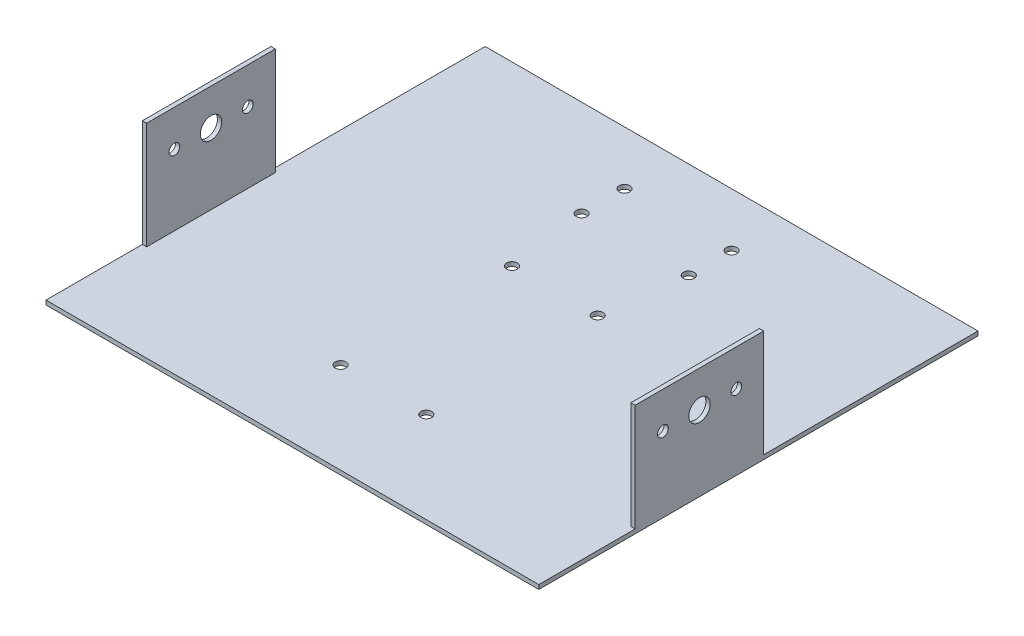
ISO-10303-21;
HEADER;
FILE_DESCRIPTION(('STEP AP214'),'2;1');
FILE_NAME('part.step','',(''),(''),'','','');
FILE_SCHEMA(('AUTOMOTIVE_DESIGN { 1 0 10303 214 1 1 1 1 }'));
ENDSEC;
DATA;
#1=APPLICATION_CONTEXT('core data for automotive mechanical design processes');
#2=APPLICATION_PROTOCOL_DEFINITION('international standard','automotive_design',2000,#1);
#3=PRODUCT_CONTEXT('',#1,'mechanical');
#4=PRODUCT('Part','Part','',(#3));
#5=PRODUCT_RELATED_PRODUCT_CATEGORY('part','',(#4));
#6=PRODUCT_DEFINITION_FORMATION('','',#4);
#7=PRODUCT_DEFINITION_CONTEXT('part definition',#1,'design');
#8=PRODUCT_DEFINITION('design','',#6,#7);
#9=PRODUCT_DEFINITION_SHAPE('','',#8);
#10=(LENGTH_UNIT() NAMED_UNIT(*) SI_UNIT(.MILLI.,.METRE.));
#11=(NAMED_UNIT(*) PLANE_ANGLE_UNIT() SI_UNIT($,.RADIAN.));
#12=(NAMED_UNIT(*) SI_UNIT($,.STERADIAN.) SOLID_ANGLE_UNIT());
#13=UNCERTAINTY_MEASURE_WITH_UNIT(LENGTH_MEASURE(1.E-05),#10,'distance_accuracy_value','');
#14=(GEOMETRIC_REPRESENTATION_CONTEXT(3) GLOBAL_UNCERTAINTY_ASSIGNED_CONTEXT((#13)) GLOBAL_UNIT_ASSIGNED_CONTEXT((#10,
#11,#12)) REPRESENTATION_CONTEXT('',''));
#15=CARTESIAN_POINT('',(0.,0.,0.));
#16=DIRECTION('',(0.,0.,1.));
#17=DIRECTION('',(1.,0.,0.));
#18=AXIS2_PLACEMENT_3D('',#15,#16,#17);
#19=CARTESIAN_POINT('',(0.,2.,0.));
#20=DIRECTION('',(0.,-1.,0.));
#21=DIRECTION('',(0.,0.,-1.));
#22=AXIS2_PLACEMENT_3D('',#19,#20,#21);
#23=PLANE('',#22);
#24=CARTESIAN_POINT('',(24.9999999999999,2.,-85.));
#25=DIRECTION('',(0.,1.,0.));
#26=DIRECTION('',(0.,0.,-1.));
#27=AXIS2_PLACEMENT_3D('',#24,#25,#26);
#28=CIRCLE('',#27,2.5);
#29=CARTESIAN_POINT('',(24.9999999999999,2.,-87.5));
#30=VERTEX_POINT('',#29);
#31=EDGE_CURVE('E258',#30,#30,#28,.T.);
#32=ORIENTED_EDGE('',*,*,#31,.F.);
#33=EDGE_LOOP('',(#32));
#34=FACE_BOUND('',#33,.T.);
#35=CARTESIAN_POINT('',(25.,2.,-105.));
#36=DIRECTION('',(0.,1.,0.));
#37=DIRECTION('',(0.,0.,-1.));
#38=AXIS2_PLACEMENT_3D('',#35,#36,#37);
#39=CIRCLE('',#38,2.5);
#40=CARTESIAN_POINT('',(25.,2.,-107.5));
#41=VERTEX_POINT('',#40);
#42=EDGE_CURVE('E254',#41,#41,#39,.T.);
#43=ORIENTED_EDGE('',*,*,#42,.F.);
#44=EDGE_LOOP('',(#43));
#45=FACE_BOUND('',#44,.T.);
#46=CARTESIAN_POINT('',(-25.,2.,-85.0000000000001));
#47=DIRECTION('',(0.,1.,0.));
#48=DIRECTION('',(0.,0.,1.));
#49=AXIS2_PLACEMENT_3D('',#46,#47,#48);
#50=CIRCLE('',#49,2.5);
#51=CARTESIAN_POINT('',(-25.,2.,-82.5000000000001));
#52=VERTEX_POINT('',#51);
#53=EDGE_CURVE('E250',#52,#52,#50,.T.);
#54=ORIENTED_EDGE('',*,*,#53,.F.);
#55=EDGE_LOOP('',(#54));
#56=FACE_BOUND('',#55,.T.);
#57=CARTESIAN_POINT('',(-25.,2.,-105.));
#58=DIRECTION('',(0.,1.,0.));
#59=DIRECTION('',(0.,0.,1.));
#60=AXIS2_PLACEMENT_3D('',#57,#58,#59);
#61=CIRCLE('',#60,2.5);
#62=CARTESIAN_POINT('',(-25.,2.,-102.5));
#63=VERTEX_POINT('',#62);
#64=EDGE_CURVE('E152',#63,#63,#61,.T.);
#65=ORIENTED_EDGE('',*,*,#64,.F.);
#66=EDGE_LOOP('',(#65));
#67=FACE_BOUND('',#66,.T.);
#68=CARTESIAN_POINT('',(20.,2.,32.4999999999999));
#69=DIRECTION('',(0.,1.,0.));
#70=DIRECTION('',(0.,0.,1.));
#71=AXIS2_PLACEMENT_3D('',#68,#69,#70);
#72=CIRCLE('',#71,2.5);
#73=CARTESIAN_POINT('',(20.,2.,35.));
#74=VERTEX_POINT('',#73);
#75=EDGE_CURVE('E155',#74,#74,#72,.T.);
#76=ORIENTED_EDGE('',*,*,#75,.F.);
#77=EDGE_LOOP('',(#76));
#78=FACE_BOUND('',#77,.T.);
#79=CARTESIAN_POINT('',(-20.,2.,32.4999999999999));
#80=DIRECTION('',(0.,1.,0.));
#81=DIRECTION('',(0.,0.,1.));
#82=AXIS2_PLACEMENT_3D('',#79,#80,#81);
#83=CIRCLE('',#82,2.5);
#84=CARTESIAN_POINT('',(-20.,2.,35.));
#85=VERTEX_POINT('',#84);
#86=EDGE_CURVE('E160',#85,#85,#83,.T.);
#87=ORIENTED_EDGE('',*,*,#86,.F.);
#88=EDGE_LOOP('',(#87));
#89=FACE_BOUND('',#88,.T.);
#90=CARTESIAN_POINT('',(20.,2.,-47.5000000000001));
#91=DIRECTION('',(0.,1.,0.));
#92=DIRECTION('',(0.,0.,1.));
#93=AXIS2_PLACEMENT_3D('',#90,#91,#92);
#94=CIRCLE('',#93,2.5);
#95=CARTESIAN_POINT('',(20.,2.,-45.0000000000001));
#96=VERTEX_POINT('',#95);
#97=EDGE_CURVE('E164',#96,#96,#94,.T.);
#98=ORIENTED_EDGE('',*,*,#97,.F.);
#99=EDGE_LOOP('',(#98));
#100=FACE_BOUND('',#99,.T.);
#101=CARTESIAN_POINT('',(-20.,2.,-47.5000000000001));
#102=DIRECTION('',(0.,1.,0.));
#103=DIRECTION('',(0.,0.,1.));
#104=AXIS2_PLACEMENT_3D('',#101,#102,#103);
#105=CIRCLE('',#104,2.5);
#106=CARTESIAN_POINT('',(-20.,2.,-45.0000000000001));
#107=VERTEX_POINT('',#106);
#108=EDGE_CURVE('E168',#107,#107,#105,.T.);
#109=ORIENTED_EDGE('',*,*,#108,.F.);
#110=EDGE_LOOP('',(#109));
#111=FACE_BOUND('',#110,.T.);
#112=DIRECTION('',(-1.,0.,0.));
#113=VECTOR('',#112,1.);
#114=CARTESIAN_POINT('',(113.,2.,-30.));
#115=LINE('',#114,#113);
#116=CARTESIAN_POINT('',(115.,2.,-30.));
#117=VERTEX_POINT('',#116);
#118=CARTESIAN_POINT('',(113.,2.,-30.));
#119=VERTEX_POINT('',#118);
#120=EDGE_CURVE('E182',#117,#119,#115,.T.);
#121=ORIENTED_EDGE('',*,*,#120,.F.);
#122=DIRECTION('',(0.,0.,-1.));
#123=VECTOR('',#122,1.);
#124=CARTESIAN_POINT('',(115.,2.,50.));
#125=LINE('',#124,#123);
#126=CARTESIAN_POINT('',(115.,2.,-130.));
#127=VERTEX_POINT('',#126);
#128=EDGE_CURVE('E313',#117,#127,#125,.T.);
#129=ORIENTED_EDGE('',*,*,#128,.T.);
#130=DIRECTION('',(-1.,0.,0.));
#131=VECTOR('',#130,1.);
#132=CARTESIAN_POINT('',(115.,2.,-130.));
#133=LINE('',#132,#131);
#134=CARTESIAN_POINT('',(-115.,2.,-130.));
#135=VERTEX_POINT('',#134);
#136=EDGE_CURVE('E143',#127,#135,#133,.T.);
#137=ORIENTED_EDGE('',*,*,#136,.T.);
#138=DIRECTION('',(0.,0.,1.));
#139=VECTOR('',#138,1.);
#140=CARTESIAN_POINT('',(-115.,2.,75.));
#141=LINE('',#140,#139);
#142=CARTESIAN_POINT('',(-115.,2.,-30.));
#143=VERTEX_POINT('',#142);
#144=EDGE_CURVE('E323',#135,#143,#141,.T.);
#145=ORIENTED_EDGE('',*,*,#144,.T.);
#146=DIRECTION('',(-1.,0.,0.));
#147=VECTOR('',#146,1.);
#148=CARTESIAN_POINT('',(-113.,2.,-30.));
#149=LINE('',#148,#147);
#150=CARTESIAN_POINT('',(-113.,2.,-30.));
#151=VERTEX_POINT('',#150);
#152=EDGE_CURVE('E211',#151,#143,#149,.T.);
#153=ORIENTED_EDGE('',*,*,#152,.F.);
#154=DIRECTION('',(0.,0.,-1.));
#155=VECTOR('',#154,1.);
#156=CARTESIAN_POINT('',(-113.,2.,30.));
#157=LINE('',#156,#155);
#158=CARTESIAN_POINT('',(-113.,2.,30.));
#159=VERTEX_POINT('',#158);
#160=EDGE_CURVE('E197',#159,#151,#157,.T.);
#161=ORIENTED_EDGE('',*,*,#160,.F.);
#162=DIRECTION('',(1.,0.,0.));
#163=VECTOR('',#162,1.);
#164=CARTESIAN_POINT('',(-113.,2.,30.));
#165=LINE('',#164,#163);
#166=CARTESIAN_POINT('',(-115.,2.,30.0000000000001));
#167=VERTEX_POINT('',#166);
#168=EDGE_CURVE('E202',#167,#159,#165,.T.);
#169=ORIENTED_EDGE('',*,*,#168,.F.);
#170=CARTESIAN_POINT('',(-115.,2.,75.));
#171=VERTEX_POINT('',#170);
#172=EDGE_CURVE('E219',#167,#171,#141,.T.);
#173=ORIENTED_EDGE('',*,*,#172,.T.);
#174=DIRECTION('',(1.,0.,0.));
#175=VECTOR('',#174,1.);
#176=CARTESIAN_POINT('',(-115.,2.,75.));
#177=LINE('',#176,#175);
#178=CARTESIAN_POINT('',(115.,2.,75.));
#179=VERTEX_POINT('',#178);
#180=EDGE_CURVE('E321',#171,#179,#177,.T.);
#181=ORIENTED_EDGE('',*,*,#180,.T.);
#182=CARTESIAN_POINT('',(115.,2.,30.));
#183=VERTEX_POINT('',#182);
#184=EDGE_CURVE('E320',#179,#183,#125,.T.);
#185=ORIENTED_EDGE('',*,*,#184,.T.);
#186=DIRECTION('',(1.,0.,0.));
#187=VECTOR('',#186,1.);
#188=CARTESIAN_POINT('',(113.,2.,30.));
#189=LINE('',#188,#187);
#190=CARTESIAN_POINT('',(113.,2.,30.));
#191=VERTEX_POINT('',#190);
#192=EDGE_CURVE('E55',#191,#183,#189,.T.);
#193=ORIENTED_EDGE('',*,*,#192,.F.);
#194=DIRECTION('',(0.,0.,1.));
#195=VECTOR('',#194,1.);
#196=CARTESIAN_POINT('',(113.,2.,30.));
#197=LINE('',#196,#195);
#198=EDGE_CURVE('E50',#119,#191,#197,.T.);
#199=ORIENTED_EDGE('',*,*,#198,.F.);
#200=EDGE_LOOP('',(#121,#129,#137,#145,#153,#161,#169,#173,#181,#185,#193,#199));
#201=FACE_BOUND('',#200,.T.);
#202=ADVANCED_FACE('F33',(#34,#45,#56,#67,#78,#89,#100,#111,#201),#23,.F.);
#203=CARTESIAN_POINT('',(-115.,2.,75.));
#204=DIRECTION('',(0.,0.,-1.));
#205=DIRECTION('',(-1.,0.,0.));
#206=AXIS2_PLACEMENT_3D('',#203,#204,#205);
#207=PLANE('',#206);
#208=DIRECTION('',(1.,0.,0.));
#209=VECTOR('',#208,1.);
#210=CARTESIAN_POINT('',(-115.,0.,75.));
#211=LINE('',#210,#209);
#212=CARTESIAN_POINT('',(-115.,0.,75.));
#213=VERTEX_POINT('',#212);
#214=CARTESIAN_POINT('',(115.,0.,75.));
#215=VERTEX_POINT('',#214);
#216=EDGE_CURVE('E135',#213,#215,#211,.T.);
#217=ORIENTED_EDGE('',*,*,#216,.T.);
#218=DIRECTION('',(0.,-1.,0.));
#219=VECTOR('',#218,1.);
#220=CARTESIAN_POINT('',(115.,2.,75.));
#221=LINE('',#220,#219);
#222=EDGE_CURVE('E42',#179,#215,#221,.T.);
#223=ORIENTED_EDGE('',*,*,#222,.F.);
#224=ORIENTED_EDGE('',*,*,#180,.F.);
#225=DIRECTION('',(0.,-1.,0.));
#226=VECTOR('',#225,1.);
#227=CARTESIAN_POINT('',(-115.,2.,75.));
#228=LINE('',#227,#226);
#229=EDGE_CURVE('E11',#171,#213,#228,.T.);
#230=ORIENTED_EDGE('',*,*,#229,.T.);
#231=EDGE_LOOP('',(#217,#223,#224,#230));
#232=FACE_BOUND('',#231,.T.);
#233=ADVANCED_FACE('F35',(#232),#207,.F.);
#234=CARTESIAN_POINT('',(115.,2.,-50.));
#235=DIRECTION('',(-1.,0.,0.));
#236=DIRECTION('',(0.,0.,1.));
#237=AXIS2_PLACEMENT_3D('',#234,#235,#236);
#238=PLANE('',#237);
#239=CARTESIAN_POINT('',(115.,35.,17.0638765129619));
#240=DIRECTION('',(-1.,0.,0.));
#241=DIRECTION('',(0.,0.,1.));
#242=AXIS2_PLACEMENT_3D('',#239,#240,#241);
#243=CIRCLE('',#242,2.5);
#244=CARTESIAN_POINT('',(115.,35.,19.5638765129619));
#245=VERTEX_POINT('',#244);
#246=EDGE_CURVE('E273',#245,#245,#243,.T.);
#247=ORIENTED_EDGE('',*,*,#246,.T.);
#248=EDGE_LOOP('',(#247));
#249=FACE_BOUND('',#248,.T.);
#250=CARTESIAN_POINT('',(115.,35.,-17.2237374562249));
#251=DIRECTION('',(-1.,0.,0.));
#252=DIRECTION('',(0.,0.,1.));
#253=AXIS2_PLACEMENT_3D('',#250,#251,#252);
#254=CIRCLE('',#253,2.5);
#255=CARTESIAN_POINT('',(115.,35.,-14.7237374562249));
#256=VERTEX_POINT('',#255);
#257=EDGE_CURVE('E270',#256,#256,#254,.T.);
#258=ORIENTED_EDGE('',*,*,#257,.T.);
#259=EDGE_LOOP('',(#258));
#260=FACE_BOUND('',#259,.T.);
#261=CARTESIAN_POINT('',(115.,35.05138551,0.));
#262=DIRECTION('',(-1.,0.,0.));
#263=DIRECTION('',(0.,0.,1.));
#264=AXIS2_PLACEMENT_3D('',#261,#262,#263);
#265=CIRCLE('',#264,5.);
#266=CARTESIAN_POINT('',(115.,35.05138551,5.00000000000002));
#267=VERTEX_POINT('',#266);
#268=EDGE_CURVE('E288',#267,#267,#265,.T.);
#269=ORIENTED_EDGE('',*,*,#268,.T.);
#270=EDGE_LOOP('',(#269));
#271=FACE_BOUND('',#270,.T.);
#272=DIRECTION('',(0.,0.,-1.));
#273=VECTOR('',#272,1.);
#274=CARTESIAN_POINT('',(115.,0.,-50.));
#275=LINE('',#274,#273);
#276=CARTESIAN_POINT('',(115.,0.,-130.));
#277=VERTEX_POINT('',#276);
#278=EDGE_CURVE('E123',#215,#277,#275,.T.);
#279=ORIENTED_EDGE('',*,*,#278,.T.);
#280=DIRECTION('',(0.,1.,0.));
#281=VECTOR('',#280,1.);
#282=CARTESIAN_POINT('',(115.,0.,-130.));
#283=LINE('',#282,#281);
#284=EDGE_CURVE('E126',#277,#127,#283,.T.);
#285=ORIENTED_EDGE('',*,*,#284,.T.);
#286=ORIENTED_EDGE('',*,*,#128,.F.);
#287=DIRECTION('',(0.,-1.,0.));
#288=VECTOR('',#287,1.);
#289=CARTESIAN_POINT('',(115.,52.,-30.));
#290=LINE('',#289,#288);
#291=CARTESIAN_POINT('',(115.,52.,-30.));
#292=VERTEX_POINT('',#291);
#293=EDGE_CURVE('E181',#292,#117,#290,.T.);
#294=ORIENTED_EDGE('',*,*,#293,.F.);
#295=DIRECTION('',(0.,0.,-1.));
#296=VECTOR('',#295,1.);
#297=CARTESIAN_POINT('',(115.,52.,-30.));
#298=LINE('',#297,#296);
#299=CARTESIAN_POINT('',(115.,52.,30.));
#300=VERTEX_POINT('',#299);
#301=EDGE_CURVE('E179',#300,#292,#298,.T.);
#302=ORIENTED_EDGE('',*,*,#301,.F.);
#303=DIRECTION('',(0.,-1.,0.));
#304=VECTOR('',#303,1.);
#305=CARTESIAN_POINT('',(115.,52.,30.));
#306=LINE('',#305,#304);
#307=EDGE_CURVE('E189',#300,#183,#306,.T.);
#308=ORIENTED_EDGE('',*,*,#307,.T.);
#309=ORIENTED_EDGE('',*,*,#184,.F.);
#310=ORIENTED_EDGE('',*,*,#222,.T.);
#311=EDGE_LOOP('',(#279,#285,#286,#294,#302,#308,#309,#310));
#312=FACE_BOUND('',#311,.T.);
#313=ADVANCED_FACE('F125',(#249,#260,#271,#312),#238,.F.);
#314=CARTESIAN_POINT('',(-115.,2.,-50.));
#315=DIRECTION('',(1.,0.,0.));
#316=DIRECTION('',(0.,0.,-1.));
#317=AXIS2_PLACEMENT_3D('',#314,#315,#316);
#318=PLANE('',#317);
#319=CARTESIAN_POINT('',(-115.,35.,17.0638765129619));
#320=DIRECTION('',(-1.,0.,0.));
#321=DIRECTION('',(0.,0.,1.));
#322=AXIS2_PLACEMENT_3D('',#319,#320,#321);
#323=CIRCLE('',#322,2.5);
#324=CARTESIAN_POINT('',(-115.,35.,19.5638765129619));
#325=VERTEX_POINT('',#324);
#326=EDGE_CURVE('E565',#325,#325,#323,.T.);
#327=ORIENTED_EDGE('',*,*,#326,.F.);
#328=EDGE_LOOP('',(#327));
#329=FACE_BOUND('',#328,.T.);
#330=CARTESIAN_POINT('',(-115.,35.,-17.2237374562249));
#331=DIRECTION('',(-1.,0.,0.));
#332=DIRECTION('',(0.,0.,1.));
#333=AXIS2_PLACEMENT_3D('',#330,#331,#332);
#334=CIRCLE('',#333,2.5);
#335=CARTESIAN_POINT('',(-115.,35.,-14.7237374562249));
#336=VERTEX_POINT('',#335);
#337=EDGE_CURVE('E266',#336,#336,#334,.T.);
#338=ORIENTED_EDGE('',*,*,#337,.F.);
#339=EDGE_LOOP('',(#338));
#340=FACE_BOUND('',#339,.T.);
#341=CARTESIAN_POINT('',(-115.,35.05138551,0.));
#342=DIRECTION('',(-1.,0.,0.));
#343=DIRECTION('',(0.,0.,1.));
#344=AXIS2_PLACEMENT_3D('',#341,#342,#343);
#345=CIRCLE('',#344,5.);
#346=CARTESIAN_POINT('',(-115.,35.05138551,5.00000000000005));
#347=VERTEX_POINT('',#346);
#348=EDGE_CURVE('E262',#347,#347,#345,.T.);
#349=ORIENTED_EDGE('',*,*,#348,.F.);
#350=EDGE_LOOP('',(#349));
#351=FACE_BOUND('',#350,.T.);
#352=DIRECTION('',(0.,0.,1.));
#353=VECTOR('',#352,1.);
#354=CARTESIAN_POINT('',(-115.,0.,-50.));
#355=LINE('',#354,#353);
#356=CARTESIAN_POINT('',(-115.,0.,-130.));
#357=VERTEX_POINT('',#356);
#358=EDGE_CURVE('E134',#357,#213,#355,.T.);
#359=ORIENTED_EDGE('',*,*,#358,.T.);
#360=ORIENTED_EDGE('',*,*,#229,.F.);
#361=ORIENTED_EDGE('',*,*,#172,.F.);
#362=DIRECTION('',(0.,-1.,0.));
#363=VECTOR('',#362,1.);
#364=CARTESIAN_POINT('',(-115.,52.,30.));
#365=LINE('',#364,#363);
#366=CARTESIAN_POINT('',(-115.,52.,30.));
#367=VERTEX_POINT('',#366);
#368=EDGE_CURVE('E226',#367,#167,#365,.T.);
#369=ORIENTED_EDGE('',*,*,#368,.F.);
#370=DIRECTION('',(0.,0.,1.));
#371=VECTOR('',#370,1.);
#372=CARTESIAN_POINT('',(-115.,52.,-30.));
#373=LINE('',#372,#371);
#374=CARTESIAN_POINT('',(-115.,52.,-30.));
#375=VERTEX_POINT('',#374);
#376=EDGE_CURVE('E204',#375,#367,#373,.T.);
#377=ORIENTED_EDGE('',*,*,#376,.F.);
#378=DIRECTION('',(0.,-1.,0.));
#379=VECTOR('',#378,1.);
#380=CARTESIAN_POINT('',(-115.,52.,-30.));
#381=LINE('',#380,#379);
#382=EDGE_CURVE('E222',#375,#143,#381,.T.);
#383=ORIENTED_EDGE('',*,*,#382,.T.);
#384=ORIENTED_EDGE('',*,*,#144,.F.);
#385=DIRECTION('',(0.,1.,0.));
#386=VECTOR('',#385,1.);
#387=CARTESIAN_POINT('',(-115.,0.,-130.));
#388=LINE('',#387,#386);
#389=EDGE_CURVE('E144',#357,#135,#388,.T.);
#390=ORIENTED_EDGE('',*,*,#389,.F.);
#391=EDGE_LOOP('',(#359,#360,#361,#369,#377,#383,#384,#390));
#392=FACE_BOUND('',#391,.T.);
#393=ADVANCED_FACE('F347',(#329,#340,#351,#392),#318,.F.);
#394=CARTESIAN_POINT('',(0.,0.,0.));
#395=DIRECTION('',(0.,-1.,0.));
#396=DIRECTION('',(0.,0.,-1.));
#397=AXIS2_PLACEMENT_3D('',#394,#395,#396);
#398=PLANE('',#397);
#399=CARTESIAN_POINT('',(24.9999999999999,0.,-85.));
#400=DIRECTION('',(0.,-1.,0.));
#401=DIRECTION('',(0.,0.,-1.));
#402=AXIS2_PLACEMENT_3D('',#399,#400,#401);
#403=CIRCLE('',#402,2.5);
#404=CARTESIAN_POINT('',(24.9999999999999,0.,-87.5));
#405=VERTEX_POINT('',#404);
#406=EDGE_CURVE('E255',#405,#405,#403,.T.);
#407=ORIENTED_EDGE('',*,*,#406,.F.);
#408=EDGE_LOOP('',(#407));
#409=FACE_BOUND('',#408,.T.);
#410=CARTESIAN_POINT('',(25.,0.,-105.));
#411=DIRECTION('',(0.,-1.,0.));
#412=DIRECTION('',(0.,0.,-1.));
#413=AXIS2_PLACEMENT_3D('',#410,#411,#412);
#414=CIRCLE('',#413,2.5);
#415=CARTESIAN_POINT('',(25.,0.,-107.5));
#416=VERTEX_POINT('',#415);
#417=EDGE_CURVE('E251',#416,#416,#414,.T.);
#418=ORIENTED_EDGE('',*,*,#417,.F.);
#419=EDGE_LOOP('',(#418));
#420=FACE_BOUND('',#419,.T.);
#421=CARTESIAN_POINT('',(-25.,0.,-85.0000000000001));
#422=DIRECTION('',(0.,-1.,0.));
#423=DIRECTION('',(0.,0.,-1.));
#424=AXIS2_PLACEMENT_3D('',#421,#422,#423);
#425=CIRCLE('',#424,2.5);
#426=CARTESIAN_POINT('',(-25.,0.,-87.5000000000001));
#427=VERTEX_POINT('',#426);
#428=EDGE_CURVE('E247',#427,#427,#425,.T.);
#429=ORIENTED_EDGE('',*,*,#428,.F.);
#430=EDGE_LOOP('',(#429));
#431=FACE_BOUND('',#430,.T.);
#432=CARTESIAN_POINT('',(-25.,0.,-105.));
#433=DIRECTION('',(0.,-1.,0.));
#434=DIRECTION('',(0.,0.,-1.));
#435=AXIS2_PLACEMENT_3D('',#432,#433,#434);
#436=CIRCLE('',#435,2.5);
#437=CARTESIAN_POINT('',(-25.,0.,-107.5));
#438=VERTEX_POINT('',#437);
#439=EDGE_CURVE('E149',#438,#438,#436,.T.);
#440=ORIENTED_EDGE('',*,*,#439,.F.);
#441=EDGE_LOOP('',(#440));
#442=FACE_BOUND('',#441,.T.);
#443=CARTESIAN_POINT('',(20.,0.,32.4999999999999));
#444=DIRECTION('',(0.,-1.,0.));
#445=DIRECTION('',(0.,0.,-1.));
#446=AXIS2_PLACEMENT_3D('',#443,#444,#445);
#447=CIRCLE('',#446,2.5);
#448=CARTESIAN_POINT('',(20.,0.,29.9999999999999));
#449=VERTEX_POINT('',#448);
#450=EDGE_CURVE('E159',#449,#449,#447,.T.);
#451=ORIENTED_EDGE('',*,*,#450,.F.);
#452=EDGE_LOOP('',(#451));
#453=FACE_BOUND('',#452,.T.);
#454=CARTESIAN_POINT('',(-20.,0.,32.4999999999999));
#455=DIRECTION('',(0.,-1.,0.));
#456=DIRECTION('',(0.,0.,-1.));
#457=AXIS2_PLACEMENT_3D('',#454,#455,#456);
#458=CIRCLE('',#457,2.5);
#459=CARTESIAN_POINT('',(-20.,0.,29.9999999999999));
#460=VERTEX_POINT('',#459);
#461=EDGE_CURVE('E163',#460,#460,#458,.T.);
#462=ORIENTED_EDGE('',*,*,#461,.F.);
#463=EDGE_LOOP('',(#462));
#464=FACE_BOUND('',#463,.T.);
#465=CARTESIAN_POINT('',(20.,0.,-47.5000000000001));
#466=DIRECTION('',(0.,-1.,0.));
#467=DIRECTION('',(0.,0.,-1.));
#468=AXIS2_PLACEMENT_3D('',#465,#466,#467);
#469=CIRCLE('',#468,2.5);
#470=CARTESIAN_POINT('',(20.,0.,-50.0000000000001));
#471=VERTEX_POINT('',#470);
#472=EDGE_CURVE('E167',#471,#471,#469,.T.);
#473=ORIENTED_EDGE('',*,*,#472,.F.);
#474=EDGE_LOOP('',(#473));
#475=FACE_BOUND('',#474,.T.);
#476=CARTESIAN_POINT('',(-20.,0.,-47.5000000000001));
#477=DIRECTION('',(0.,-1.,0.));
#478=DIRECTION('',(0.,0.,-1.));
#479=AXIS2_PLACEMENT_3D('',#476,#477,#478);
#480=CIRCLE('',#479,2.5);
#481=CARTESIAN_POINT('',(-20.,0.,-50.0000000000001));
#482=VERTEX_POINT('',#481);
#483=EDGE_CURVE('E171',#482,#482,#480,.T.);
#484=ORIENTED_EDGE('',*,*,#483,.F.);
#485=EDGE_LOOP('',(#484));
#486=FACE_BOUND('',#485,.T.);
#487=ORIENTED_EDGE('',*,*,#216,.F.);
#488=ORIENTED_EDGE('',*,*,#358,.F.);
#489=DIRECTION('',(-1.,0.,0.));
#490=VECTOR('',#489,1.);
#491=CARTESIAN_POINT('',(115.,0.,-130.));
#492=LINE('',#491,#490);
#493=EDGE_CURVE('E141',#277,#357,#492,.T.);
#494=ORIENTED_EDGE('',*,*,#493,.F.);
#495=ORIENTED_EDGE('',*,*,#278,.F.);
#496=EDGE_LOOP('',(#487,#488,#494,#495));
#497=FACE_BOUND('',#496,.T.);
#498=ADVANCED_FACE('F146',(#409,#420,#431,#442,#453,#464,#475,#486,#497),#398,.T.);
#499=CARTESIAN_POINT('',(-113.,52.,30.));
#500=DIRECTION('',(-1.,0.,0.));
#501=DIRECTION('',(0.,0.,1.));
#502=AXIS2_PLACEMENT_3D('',#499,#500,#501);
#503=PLANE('',#502);
#504=CARTESIAN_POINT('',(-113.,35.,17.0638765129619));
#505=DIRECTION('',(-1.,0.,0.));
#506=DIRECTION('',(0.,0.,1.));
#507=AXIS2_PLACEMENT_3D('',#504,#505,#506);
#508=CIRCLE('',#507,2.5);
#509=CARTESIAN_POINT('',(-113.,35.,19.5638765129619));
#510=VERTEX_POINT('',#509);
#511=EDGE_CURVE('E278',#510,#510,#508,.T.);
#512=ORIENTED_EDGE('',*,*,#511,.T.);
#513=EDGE_LOOP('',(#512));
#514=FACE_BOUND('',#513,.T.);
#515=CARTESIAN_POINT('',(-113.,35.,-17.2237374562249));
#516=DIRECTION('',(-1.,0.,0.));
#517=DIRECTION('',(0.,0.,1.));
#518=AXIS2_PLACEMENT_3D('',#515,#516,#517);
#519=CIRCLE('',#518,2.5);
#520=CARTESIAN_POINT('',(-113.,35.,-14.7237374562249));
#521=VERTEX_POINT('',#520);
#522=EDGE_CURVE('E265',#521,#521,#519,.T.);
#523=ORIENTED_EDGE('',*,*,#522,.T.);
#524=EDGE_LOOP('',(#523));
#525=FACE_BOUND('',#524,.T.);
#526=CARTESIAN_POINT('',(-113.,35.05138551,0.));
#527=DIRECTION('',(-1.,0.,0.));
#528=DIRECTION('',(0.,0.,1.));
#529=AXIS2_PLACEMENT_3D('',#526,#527,#528);
#530=CIRCLE('',#529,5.);
#531=CARTESIAN_POINT('',(-113.,35.05138551,5.00000000000005));
#532=VERTEX_POINT('',#531);
#533=EDGE_CURVE('E261',#532,#532,#530,.T.);
#534=ORIENTED_EDGE('',*,*,#533,.T.);
#535=EDGE_LOOP('',(#534));
#536=FACE_BOUND('',#535,.T.);
#537=ORIENTED_EDGE('',*,*,#160,.T.);
#538=DIRECTION('',(0.,-1.,0.));
#539=VECTOR('',#538,1.);
#540=CARTESIAN_POINT('',(-113.,52.,-30.));
#541=LINE('',#540,#539);
#542=CARTESIAN_POINT('',(-113.,52.,-30.));
#543=VERTEX_POINT('',#542);
#544=EDGE_CURVE('E225',#543,#151,#541,.T.);
#545=ORIENTED_EDGE('',*,*,#544,.F.);
#546=DIRECTION('',(0.,0.,-1.));
#547=VECTOR('',#546,1.);
#548=CARTESIAN_POINT('',(-113.,52.,30.));
#549=LINE('',#548,#547);
#550=CARTESIAN_POINT('',(-113.,52.,30.));
#551=VERTEX_POINT('',#550);
#552=EDGE_CURVE('E198',#551,#543,#549,.T.);
#553=ORIENTED_EDGE('',*,*,#552,.F.);
#554=DIRECTION('',(0.,-1.,0.));
#555=VECTOR('',#554,1.);
#556=CARTESIAN_POINT('',(-113.,52.,30.));
#557=LINE('',#556,#555);
#558=EDGE_CURVE('E208',#551,#159,#557,.T.);
#559=ORIENTED_EDGE('',*,*,#558,.T.);
#560=EDGE_LOOP('',(#537,#545,#553,#559));
#561=FACE_BOUND('',#560,.T.);
#562=ADVANCED_FACE('F338',(#514,#525,#536,#561),#503,.F.);
#563=CARTESIAN_POINT('',(-113.,52.,-30.));
#564=DIRECTION('',(0.,0.,1.));
#565=DIRECTION('',(1.,0.,0.));
#566=AXIS2_PLACEMENT_3D('',#563,#564,#565);
#567=PLANE('',#566);
#568=ORIENTED_EDGE('',*,*,#152,.T.);
#569=ORIENTED_EDGE('',*,*,#382,.F.);
#570=DIRECTION('',(-1.,0.,0.));
#571=VECTOR('',#570,1.);
#572=CARTESIAN_POINT('',(-113.,52.,-30.));
#573=LINE('',#572,#571);
#574=EDGE_CURVE('E201',#543,#375,#573,.T.);
#575=ORIENTED_EDGE('',*,*,#574,.F.);
#576=ORIENTED_EDGE('',*,*,#544,.T.);
#577=EDGE_LOOP('',(#568,#569,#575,#576));
#578=FACE_BOUND('',#577,.T.);
#579=ADVANCED_FACE('F333',(#578),#567,.F.);
#580=CARTESIAN_POINT('',(-113.,52.,30.));
#581=DIRECTION('',(0.,0.,-1.));
#582=DIRECTION('',(-1.,0.,0.));
#583=AXIS2_PLACEMENT_3D('',#580,#581,#582);
#584=PLANE('',#583);
#585=ORIENTED_EDGE('',*,*,#168,.T.);
#586=ORIENTED_EDGE('',*,*,#558,.F.);
#587=DIRECTION('',(1.,0.,0.));
#588=VECTOR('',#587,1.);
#589=CARTESIAN_POINT('',(-113.,52.,30.));
#590=LINE('',#589,#588);
#591=EDGE_CURVE('E206',#367,#551,#590,.T.);
#592=ORIENTED_EDGE('',*,*,#591,.F.);
#593=ORIENTED_EDGE('',*,*,#368,.T.);
#594=EDGE_LOOP('',(#585,#586,#592,#593));
#595=FACE_BOUND('',#594,.T.);
#596=ADVANCED_FACE('F342',(#595),#584,.F.);
#597=CARTESIAN_POINT('',(0.,52.,0.));
#598=DIRECTION('',(0.,1.,0.));
#599=DIRECTION('',(0.,0.,1.));
#600=AXIS2_PLACEMENT_3D('',#597,#598,#599);
#601=PLANE('',#600);
#602=ORIENTED_EDGE('',*,*,#552,.T.);
#603=ORIENTED_EDGE('',*,*,#574,.T.);
#604=ORIENTED_EDGE('',*,*,#376,.T.);
#605=ORIENTED_EDGE('',*,*,#591,.T.);
#606=EDGE_LOOP('',(#602,#603,#604,#605));
#607=FACE_BOUND('',#606,.T.);
#608=ADVANCED_FACE('F378',(#607),#601,.T.);
#609=CARTESIAN_POINT('',(113.,52.,-30.));
#610=DIRECTION('',(0.,0.,1.));
#611=DIRECTION('',(1.,0.,0.));
#612=AXIS2_PLACEMENT_3D('',#609,#610,#611);
#613=PLANE('',#612);
#614=ORIENTED_EDGE('',*,*,#120,.T.);
#615=DIRECTION('',(0.,-1.,0.));
#616=VECTOR('',#615,1.);
#617=CARTESIAN_POINT('',(113.,52.,-30.));
#618=LINE('',#617,#616);
#619=CARTESIAN_POINT('',(113.,52.,-30.));
#620=VERTEX_POINT('',#619);
#621=EDGE_CURVE('E195',#620,#119,#618,.T.);
#622=ORIENTED_EDGE('',*,*,#621,.F.);
#623=DIRECTION('',(-1.,0.,0.));
#624=VECTOR('',#623,1.);
#625=CARTESIAN_POINT('',(113.,52.,-30.));
#626=LINE('',#625,#624);
#627=EDGE_CURVE('E172',#292,#620,#626,.T.);
#628=ORIENTED_EDGE('',*,*,#627,.F.);
#629=ORIENTED_EDGE('',*,*,#293,.T.);
#630=EDGE_LOOP('',(#614,#622,#628,#629));
#631=FACE_BOUND('',#630,.T.);
#632=ADVANCED_FACE('F318',(#631),#613,.F.);
#633=CARTESIAN_POINT('',(113.,52.,30.));
#634=DIRECTION('',(1.,0.,0.));
#635=DIRECTION('',(0.,0.,-1.));
#636=AXIS2_PLACEMENT_3D('',#633,#634,#635);
#637=PLANE('',#636);
#638=CARTESIAN_POINT('',(113.,35.,17.0638765129619));
#639=DIRECTION('',(1.,0.,0.));
#640=DIRECTION('',(0.,0.,-1.));
#641=AXIS2_PLACEMENT_3D('',#638,#639,#640);
#642=CIRCLE('',#641,2.5);
#643=CARTESIAN_POINT('',(113.,35.,14.5638765129619));
#644=VERTEX_POINT('',#643);
#645=EDGE_CURVE('E37',#644,#644,#642,.T.);
#646=ORIENTED_EDGE('',*,*,#645,.T.);
#647=EDGE_LOOP('',(#646));
#648=FACE_BOUND('',#647,.T.);
#649=CARTESIAN_POINT('',(113.,35.,-17.2237374562249));
#650=DIRECTION('',(1.,0.,0.));
#651=DIRECTION('',(0.,0.,-1.));
#652=AXIS2_PLACEMENT_3D('',#649,#650,#651);
#653=CIRCLE('',#652,2.5);
#654=CARTESIAN_POINT('',(113.,35.,-19.7237374562249));
#655=VERTEX_POINT('',#654);
#656=EDGE_CURVE('E263',#655,#655,#653,.T.);
#657=ORIENTED_EDGE('',*,*,#656,.T.);
#658=EDGE_LOOP('',(#657));
#659=FACE_BOUND('',#658,.T.);
#660=CARTESIAN_POINT('',(113.,35.05138551,0.));
#661=DIRECTION('',(1.,0.,0.));
#662=DIRECTION('',(0.,0.,-1.));
#663=AXIS2_PLACEMENT_3D('',#660,#661,#662);
#664=CIRCLE('',#663,5.);
#665=CARTESIAN_POINT('',(113.,35.05138551,-4.99999999999998));
#666=VERTEX_POINT('',#665);
#667=EDGE_CURVE('E259',#666,#666,#664,.T.);
#668=ORIENTED_EDGE('',*,*,#667,.T.);
#669=EDGE_LOOP('',(#668));
#670=FACE_BOUND('',#669,.T.);
#671=ORIENTED_EDGE('',*,*,#198,.T.);
#672=DIRECTION('',(0.,-1.,0.));
#673=VECTOR('',#672,1.);
#674=CARTESIAN_POINT('',(113.,52.,30.));
#675=LINE('',#674,#673);
#676=CARTESIAN_POINT('',(113.,52.,30.));
#677=VERTEX_POINT('',#676);
#678=EDGE_CURVE('E192',#677,#191,#675,.T.);
#679=ORIENTED_EDGE('',*,*,#678,.F.);
#680=DIRECTION('',(0.,0.,1.));
#681=VECTOR('',#680,1.);
#682=CARTESIAN_POINT('',(113.,52.,30.));
#683=LINE('',#682,#681);
#684=EDGE_CURVE('E175',#620,#677,#683,.T.);
#685=ORIENTED_EDGE('',*,*,#684,.F.);
#686=ORIENTED_EDGE('',*,*,#621,.T.);
#687=EDGE_LOOP('',(#671,#679,#685,#686));
#688=FACE_BOUND('',#687,.T.);
#689=ADVANCED_FACE('F357',(#648,#659,#670,#688),#637,.F.);
#690=CARTESIAN_POINT('',(113.,52.,30.));
#691=DIRECTION('',(0.,0.,-1.));
#692=DIRECTION('',(-1.,0.,0.));
#693=AXIS2_PLACEMENT_3D('',#690,#691,#692);
#694=PLANE('',#693);
#695=ORIENTED_EDGE('',*,*,#192,.T.);
#696=ORIENTED_EDGE('',*,*,#307,.F.);
#697=DIRECTION('',(1.,0.,0.));
#698=VECTOR('',#697,1.);
#699=CARTESIAN_POINT('',(113.,52.,30.));
#700=LINE('',#699,#698);
#701=EDGE_CURVE('E177',#677,#300,#700,.T.);
#702=ORIENTED_EDGE('',*,*,#701,.F.);
#703=ORIENTED_EDGE('',*,*,#678,.T.);
#704=EDGE_LOOP('',(#695,#696,#702,#703));
#705=FACE_BOUND('',#704,.T.);
#706=ADVANCED_FACE('F353',(#705),#694,.F.);
#707=CARTESIAN_POINT('',(0.,52.,0.));
#708=DIRECTION('',(0.,-1.,0.));
#709=DIRECTION('',(0.,0.,-1.));
#710=AXIS2_PLACEMENT_3D('',#707,#708,#709);
#711=PLANE('',#710);
#712=ORIENTED_EDGE('',*,*,#627,.T.);
#713=ORIENTED_EDGE('',*,*,#684,.T.);
#714=ORIENTED_EDGE('',*,*,#701,.T.);
#715=ORIENTED_EDGE('',*,*,#301,.T.);
#716=EDGE_LOOP('',(#712,#713,#714,#715));
#717=FACE_BOUND('',#716,.T.);
#718=ADVANCED_FACE('F359',(#717),#711,.F.);
#719=CARTESIAN_POINT('',(-20.,-18.,-47.5000000000001));
#720=DIRECTION('',(0.,1.,0.));
#721=DIRECTION('',(0.,0.,1.));
#722=AXIS2_PLACEMENT_3D('',#719,#720,#721);
#723=CYLINDRICAL_SURFACE('',#722,2.5);
#724=ORIENTED_EDGE('',*,*,#483,.T.);
#725=EDGE_LOOP('',(#724));
#726=FACE_BOUND('',#725,.T.);
#727=ORIENTED_EDGE('',*,*,#108,.T.);
#728=EDGE_LOOP('',(#727));
#729=FACE_BOUND('',#728,.T.);
#730=ADVANCED_FACE('F361',(#726,#729),#723,.F.);
#731=CARTESIAN_POINT('',(20.,-18.,-47.5000000000001));
#732=DIRECTION('',(0.,1.,0.));
#733=DIRECTION('',(0.,0.,1.));
#734=AXIS2_PLACEMENT_3D('',#731,#732,#733);
#735=CYLINDRICAL_SURFACE('',#734,2.5);
#736=ORIENTED_EDGE('',*,*,#472,.T.);
#737=EDGE_LOOP('',(#736));
#738=FACE_BOUND('',#737,.T.);
#739=ORIENTED_EDGE('',*,*,#97,.T.);
#740=EDGE_LOOP('',(#739));
#741=FACE_BOUND('',#740,.T.);
#742=ADVANCED_FACE('F367',(#738,#741),#735,.F.);
#743=CARTESIAN_POINT('',(-20.,-8.,32.4999999999999));
#744=DIRECTION('',(0.,1.,0.));
#745=DIRECTION('',(0.,0.,1.));
#746=AXIS2_PLACEMENT_3D('',#743,#744,#745);
#747=CYLINDRICAL_SURFACE('',#746,2.5);
#748=ORIENTED_EDGE('',*,*,#461,.T.);
#749=EDGE_LOOP('',(#748));
#750=FACE_BOUND('',#749,.T.);
#751=ORIENTED_EDGE('',*,*,#86,.T.);
#752=EDGE_LOOP('',(#751));
#753=FACE_BOUND('',#752,.T.);
#754=ADVANCED_FACE('F439',(#750,#753),#747,.F.);
#755=CARTESIAN_POINT('',(20.,-8.,32.4999999999999));
#756=DIRECTION('',(0.,1.,0.));
#757=DIRECTION('',(0.,0.,1.));
#758=AXIS2_PLACEMENT_3D('',#755,#756,#757);
#759=CYLINDRICAL_SURFACE('',#758,2.5);
#760=ORIENTED_EDGE('',*,*,#450,.T.);
#761=EDGE_LOOP('',(#760));
#762=FACE_BOUND('',#761,.T.);
#763=ORIENTED_EDGE('',*,*,#75,.T.);
#764=EDGE_LOOP('',(#763));
#765=FACE_BOUND('',#764,.T.);
#766=ADVANCED_FACE('F436',(#762,#765),#759,.F.);
#767=CARTESIAN_POINT('',(115.,0.,-130.));
#768=DIRECTION('',(0.,0.,-1.));
#769=DIRECTION('',(-1.,0.,0.));
#770=AXIS2_PLACEMENT_3D('',#767,#768,#769);
#771=PLANE('',#770);
#772=ORIENTED_EDGE('',*,*,#136,.F.);
#773=ORIENTED_EDGE('',*,*,#284,.F.);
#774=ORIENTED_EDGE('',*,*,#493,.T.);
#775=ORIENTED_EDGE('',*,*,#389,.T.);
#776=EDGE_LOOP('',(#772,#773,#774,#775));
#777=FACE_BOUND('',#776,.T.);
#778=ADVANCED_FACE('F139',(#777),#771,.T.);
#779=CARTESIAN_POINT('',(-25.,-14.,-105.));
#780=DIRECTION('',(0.,1.,0.));
#781=DIRECTION('',(0.,0.,1.));
#782=AXIS2_PLACEMENT_3D('',#779,#780,#781);
#783=CYLINDRICAL_SURFACE('',#782,2.5);
#784=ORIENTED_EDGE('',*,*,#439,.T.);
#785=EDGE_LOOP('',(#784));
#786=FACE_BOUND('',#785,.T.);
#787=ORIENTED_EDGE('',*,*,#64,.T.);
#788=EDGE_LOOP('',(#787));
#789=FACE_BOUND('',#788,.T.);
#790=ADVANCED_FACE('F429',(#786,#789),#783,.F.);
#791=CARTESIAN_POINT('',(-25.,-14.,-85.0000000000001));
#792=DIRECTION('',(0.,1.,0.));
#793=DIRECTION('',(0.,0.,1.));
#794=AXIS2_PLACEMENT_3D('',#791,#792,#793);
#795=CYLINDRICAL_SURFACE('',#794,2.5);
#796=ORIENTED_EDGE('',*,*,#428,.T.);
#797=EDGE_LOOP('',(#796));
#798=FACE_BOUND('',#797,.T.);
#799=ORIENTED_EDGE('',*,*,#53,.T.);
#800=EDGE_LOOP('',(#799));
#801=FACE_BOUND('',#800,.T.);
#802=ADVANCED_FACE('F297',(#798,#801),#795,.F.);
#803=CARTESIAN_POINT('',(25.,-14.,-105.));
#804=DIRECTION('',(0.,1.,0.));
#805=DIRECTION('',(0.,0.,1.));
#806=AXIS2_PLACEMENT_3D('',#803,#804,#805);
#807=CYLINDRICAL_SURFACE('',#806,2.5);
#808=ORIENTED_EDGE('',*,*,#417,.T.);
#809=EDGE_LOOP('',(#808));
#810=FACE_BOUND('',#809,.T.);
#811=ORIENTED_EDGE('',*,*,#42,.T.);
#812=EDGE_LOOP('',(#811));
#813=FACE_BOUND('',#812,.T.);
#814=ADVANCED_FACE('F417',(#810,#813),#807,.F.);
#815=CARTESIAN_POINT('',(24.9999999999999,-14.,-85.));
#816=DIRECTION('',(0.,1.,0.));
#817=DIRECTION('',(0.,0.,1.));
#818=AXIS2_PLACEMENT_3D('',#815,#816,#817);
#819=CYLINDRICAL_SURFACE('',#818,2.5);
#820=ORIENTED_EDGE('',*,*,#406,.T.);
#821=EDGE_LOOP('',(#820));
#822=FACE_BOUND('',#821,.T.);
#823=ORIENTED_EDGE('',*,*,#31,.T.);
#824=EDGE_LOOP('',(#823));
#825=FACE_BOUND('',#824,.T.);
#826=ADVANCED_FACE('F408',(#822,#825),#819,.F.);
#827=CARTESIAN_POINT('',(127.,35.05138551,0.));
#828=DIRECTION('',(-1.,0.,0.));
#829=DIRECTION('',(0.,0.,1.));
#830=AXIS2_PLACEMENT_3D('',#827,#828,#829);
#831=CYLINDRICAL_SURFACE('',#830,5.);
#832=ORIENTED_EDGE('',*,*,#667,.F.);
#833=EDGE_LOOP('',(#832));
#834=FACE_BOUND('',#833,.T.);
#835=ORIENTED_EDGE('',*,*,#268,.F.);
#836=EDGE_LOOP('',(#835));
#837=FACE_BOUND('',#836,.T.);
#838=ADVANCED_FACE('F405',(#834,#837),#831,.F.);
#839=ORIENTED_EDGE('',*,*,#348,.T.);
#840=EDGE_LOOP('',(#839));
#841=FACE_BOUND('',#840,.T.);
#842=ORIENTED_EDGE('',*,*,#533,.F.);
#843=EDGE_LOOP('',(#842));
#844=FACE_BOUND('',#843,.T.);
#845=ADVANCED_FACE('F407',(#841,#844),#831,.F.);
#846=CARTESIAN_POINT('',(127.,35.,-17.2237374562249));
#847=DIRECTION('',(-1.,0.,0.));
#848=DIRECTION('',(0.,0.,1.));
#849=AXIS2_PLACEMENT_3D('',#846,#847,#848);
#850=CYLINDRICAL_SURFACE('',#849,2.5);
#851=ORIENTED_EDGE('',*,*,#656,.F.);
#852=EDGE_LOOP('',(#851));
#853=FACE_BOUND('',#852,.T.);
#854=ORIENTED_EDGE('',*,*,#257,.F.);
#855=EDGE_LOOP('',(#854));
#856=FACE_BOUND('',#855,.T.);
#857=ADVANCED_FACE('F415',(#853,#856),#850,.F.);
#858=ORIENTED_EDGE('',*,*,#337,.T.);
#859=EDGE_LOOP('',(#858));
#860=FACE_BOUND('',#859,.T.);
#861=ORIENTED_EDGE('',*,*,#522,.F.);
#862=EDGE_LOOP('',(#861));
#863=FACE_BOUND('',#862,.T.);
#864=ADVANCED_FACE('F533',(#860,#863),#850,.F.);
#865=CARTESIAN_POINT('',(127.,35.,17.0638765129619));
#866=DIRECTION('',(-1.,0.,0.));
#867=DIRECTION('',(0.,0.,1.));
#868=AXIS2_PLACEMENT_3D('',#865,#866,#867);
#869=CYLINDRICAL_SURFACE('',#868,2.5);
#870=ORIENTED_EDGE('',*,*,#645,.F.);
#871=EDGE_LOOP('',(#870));
#872=FACE_BOUND('',#871,.T.);
#873=ORIENTED_EDGE('',*,*,#246,.F.);
#874=EDGE_LOOP('',(#873));
#875=FACE_BOUND('',#874,.T.);
#876=ADVANCED_FACE('F542',(#872,#875),#869,.F.);
#877=ORIENTED_EDGE('',*,*,#326,.T.);
#878=EDGE_LOOP('',(#877));
#879=FACE_BOUND('',#878,.T.);
#880=ORIENTED_EDGE('',*,*,#511,.F.);
#881=EDGE_LOOP('',(#880));
#882=FACE_BOUND('',#881,.T.);
#883=ADVANCED_FACE('F550',(#879,#882),#869,.F.);
#884=CLOSED_SHELL('',(#202,#233,#313,#393,#498,#562,#579,#596,#608,#632,#689,#706,#718,#730,
#742,#754,#766,#778,#790,#802,#814,#826,#838,#845,#857,#864,#876,#883));
#885=MANIFOLD_SOLID_BREP('B2',#884);
#886=ADVANCED_BREP_SHAPE_REPRESENTATION('',(#18,#885),#14);
#887=SHAPE_DEFINITION_REPRESENTATION(#9,#886);
ENDSEC;
END-ISO-10303-21;
